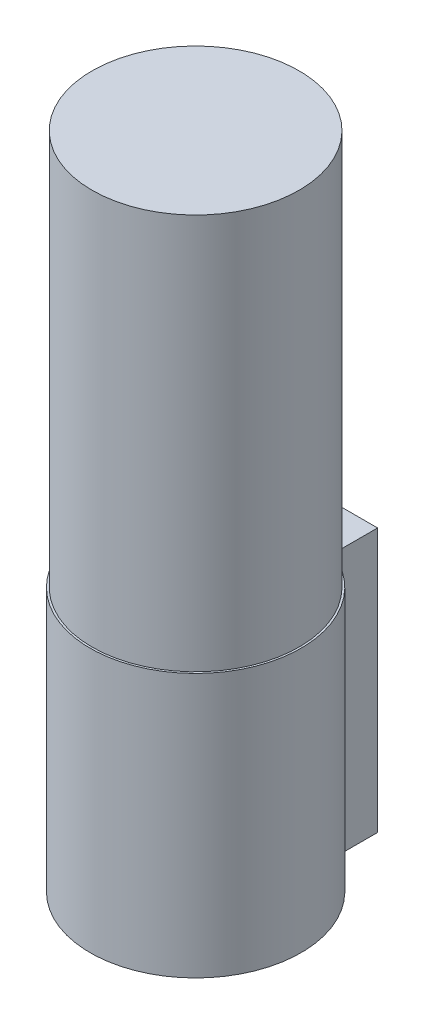
ISO-10303-21;
HEADER;
FILE_DESCRIPTION(('STEP AP214'),'2;1');
FILE_NAME('part.step','',(''),(''),'','','');
FILE_SCHEMA(('AUTOMOTIVE_DESIGN { 1 0 10303 214 1 1 1 1 }'));
ENDSEC;
DATA;
#1=APPLICATION_CONTEXT('core data for automotive mechanical design processes');
#2=APPLICATION_PROTOCOL_DEFINITION('international standard','automotive_design',2000,#1);
#3=PRODUCT_CONTEXT('',#1,'mechanical');
#4=PRODUCT('Part','Part','',(#3));
#5=PRODUCT_RELATED_PRODUCT_CATEGORY('part','',(#4));
#6=PRODUCT_DEFINITION_FORMATION('','',#4);
#7=PRODUCT_DEFINITION_CONTEXT('part definition',#1,'design');
#8=PRODUCT_DEFINITION('design','',#6,#7);
#9=PRODUCT_DEFINITION_SHAPE('','',#8);
#10=(LENGTH_UNIT() NAMED_UNIT(*) SI_UNIT(.MILLI.,.METRE.));
#11=(NAMED_UNIT(*) PLANE_ANGLE_UNIT() SI_UNIT($,.RADIAN.));
#12=(NAMED_UNIT(*) SI_UNIT($,.STERADIAN.) SOLID_ANGLE_UNIT());
#13=UNCERTAINTY_MEASURE_WITH_UNIT(LENGTH_MEASURE(1.E-05),#10,'distance_accuracy_value','');
#14=(GEOMETRIC_REPRESENTATION_CONTEXT(3) GLOBAL_UNCERTAINTY_ASSIGNED_CONTEXT((#13)) GLOBAL_UNIT_ASSIGNED_CONTEXT((#10,
#11,#12)) REPRESENTATION_CONTEXT('',''));
#15=CARTESIAN_POINT('',(0.,0.,0.));
#16=DIRECTION('',(0.,0.,1.));
#17=DIRECTION('',(1.,0.,0.));
#18=AXIS2_PLACEMENT_3D('',#15,#16,#17);
#19=CARTESIAN_POINT('',(0.,10.,0.));
#20=DIRECTION('',(0.,-1.,0.));
#21=DIRECTION('',(0.,0.,-1.));
#22=AXIS2_PLACEMENT_3D('',#19,#20,#21);
#23=CYLINDRICAL_SURFACE('',#22,4.);
#24=CARTESIAN_POINT('',(0.,0.,0.));
#25=DIRECTION('',(0.,1.,0.));
#26=DIRECTION('',(0.,0.,1.));
#27=AXIS2_PLACEMENT_3D('',#24,#25,#26);
#28=CIRCLE('',#27,4.);
#29=CARTESIAN_POINT('',(-1.5,0.,-3.70809924354783));
#30=VERTEX_POINT('',#29);
#31=CARTESIAN_POINT('',(1.5,0.,-3.70809924354783));
#32=VERTEX_POINT('',#31);
#33=EDGE_CURVE('E107',#30,#32,#28,.T.);
#34=ORIENTED_EDGE('',*,*,#33,.T.);
#35=DIRECTION('',(0.,-1.,0.));
#36=VECTOR('',#35,1.);
#37=CARTESIAN_POINT('',(1.5,10.,-3.70809924354783));
#38=LINE('',#37,#36);
#39=CARTESIAN_POINT('',(1.5,10.,-3.70809924354783));
#40=VERTEX_POINT('',#39);
#41=EDGE_CURVE('E45',#40,#32,#38,.T.);
#42=ORIENTED_EDGE('',*,*,#41,.F.);
#43=CARTESIAN_POINT('',(0.,10.,0.));
#44=DIRECTION('',(0.,1.,0.));
#45=DIRECTION('',(0.,0.,1.));
#46=AXIS2_PLACEMENT_3D('',#43,#44,#45);
#47=CIRCLE('',#46,4.);
#48=CARTESIAN_POINT('',(-1.5,10.,-3.70809924354783));
#49=VERTEX_POINT('',#48);
#50=EDGE_CURVE('E83',#49,#40,#47,.T.);
#51=ORIENTED_EDGE('',*,*,#50,.F.);
#52=DIRECTION('',(0.,-1.,0.));
#53=VECTOR('',#52,1.);
#54=CARTESIAN_POINT('',(-1.5,10.,-3.70809924354783));
#55=LINE('',#54,#53);
#56=EDGE_CURVE('E103',#49,#30,#55,.T.);
#57=ORIENTED_EDGE('',*,*,#56,.T.);
#58=EDGE_LOOP('',(#34,#42,#51,#57));
#59=FACE_BOUND('',#58,.T.);
#60=ADVANCED_FACE('F42',(#59),#23,.T.);
#61=CARTESIAN_POINT('',(1.5,10.,0.));
#62=DIRECTION('',(1.,0.,0.));
#63=DIRECTION('',(0.,0.,-1.));
#64=AXIS2_PLACEMENT_3D('',#61,#62,#63);
#65=PLANE('',#64);
#66=DIRECTION('',(0.,0.,1.));
#67=VECTOR('',#66,1.);
#68=CARTESIAN_POINT('',(1.5,0.,0.));
#69=LINE('',#68,#67);
#70=CARTESIAN_POINT('',(1.5,0.,-5.4));
#71=VERTEX_POINT('',#70);
#72=EDGE_CURVE('E93',#71,#32,#69,.T.);
#73=ORIENTED_EDGE('',*,*,#72,.F.);
#74=DIRECTION('',(0.,-1.,0.));
#75=VECTOR('',#74,1.);
#76=CARTESIAN_POINT('',(1.5,10.,-5.4));
#77=LINE('',#76,#75);
#78=CARTESIAN_POINT('',(1.5,10.,-5.4));
#79=VERTEX_POINT('',#78);
#80=EDGE_CURVE('E89',#79,#71,#77,.T.);
#81=ORIENTED_EDGE('',*,*,#80,.F.);
#82=DIRECTION('',(0.,0.,1.));
#83=VECTOR('',#82,1.);
#84=CARTESIAN_POINT('',(1.5,10.,0.));
#85=LINE('',#84,#83);
#86=EDGE_CURVE('E91',#79,#40,#85,.T.);
#87=ORIENTED_EDGE('',*,*,#86,.T.);
#88=ORIENTED_EDGE('',*,*,#41,.T.);
#89=EDGE_LOOP('',(#73,#81,#87,#88));
#90=FACE_BOUND('',#89,.T.);
#91=ADVANCED_FACE('F90',(#90),#65,.T.);
#92=CARTESIAN_POINT('',(0.,10.,-5.4));
#93=DIRECTION('',(0.,0.,-1.));
#94=DIRECTION('',(-1.,0.,0.));
#95=AXIS2_PLACEMENT_3D('',#92,#93,#94);
#96=PLANE('',#95);
#97=DIRECTION('',(1.,0.,0.));
#98=VECTOR('',#97,1.);
#99=CARTESIAN_POINT('',(0.,0.,-5.4));
#100=LINE('',#99,#98);
#101=CARTESIAN_POINT('',(-1.5,0.,-5.4));
#102=VERTEX_POINT('',#101);
#103=EDGE_CURVE('E112',#102,#71,#100,.T.);
#104=ORIENTED_EDGE('',*,*,#103,.F.);
#105=DIRECTION('',(0.,-1.,0.));
#106=VECTOR('',#105,1.);
#107=CARTESIAN_POINT('',(-1.5,10.,-5.4));
#108=LINE('',#107,#106);
#109=CARTESIAN_POINT('',(-1.5,10.,-5.4));
#110=VERTEX_POINT('',#109);
#111=EDGE_CURVE('E75',#110,#102,#108,.T.);
#112=ORIENTED_EDGE('',*,*,#111,.F.);
#113=DIRECTION('',(1.,0.,0.));
#114=VECTOR('',#113,1.);
#115=CARTESIAN_POINT('',(0.,10.,-5.4));
#116=LINE('',#115,#114);
#117=EDGE_CURVE('E99',#110,#79,#116,.T.);
#118=ORIENTED_EDGE('',*,*,#117,.T.);
#119=ORIENTED_EDGE('',*,*,#80,.T.);
#120=EDGE_LOOP('',(#104,#112,#118,#119));
#121=FACE_BOUND('',#120,.T.);
#122=ADVANCED_FACE('F101',(#121),#96,.T.);
#123=CARTESIAN_POINT('',(-1.5,10.,0.));
#124=DIRECTION('',(1.,0.,0.));
#125=DIRECTION('',(0.,0.,-1.));
#126=AXIS2_PLACEMENT_3D('',#123,#124,#125);
#127=PLANE('',#126);
#128=DIRECTION('',(0.,0.,1.));
#129=VECTOR('',#128,1.);
#130=CARTESIAN_POINT('',(-1.5,0.,0.));
#131=LINE('',#130,#129);
#132=EDGE_CURVE('E78',#102,#30,#131,.T.);
#133=ORIENTED_EDGE('',*,*,#132,.T.);
#134=ORIENTED_EDGE('',*,*,#56,.F.);
#135=DIRECTION('',(0.,0.,1.));
#136=VECTOR('',#135,1.);
#137=CARTESIAN_POINT('',(-1.5,10.,0.));
#138=LINE('',#137,#136);
#139=EDGE_CURVE('E59',#110,#49,#138,.T.);
#140=ORIENTED_EDGE('',*,*,#139,.F.);
#141=ORIENTED_EDGE('',*,*,#111,.T.);
#142=EDGE_LOOP('',(#133,#134,#140,#141));
#143=FACE_BOUND('',#142,.T.);
#144=ADVANCED_FACE('F130',(#143),#127,.F.);
#145=CARTESIAN_POINT('',(0.,10.,0.));
#146=DIRECTION('',(0.,1.,0.));
#147=DIRECTION('',(0.,0.,1.));
#148=AXIS2_PLACEMENT_3D('',#145,#146,#147);
#149=PLANE('',#148);
#150=CARTESIAN_POINT('',(0.,10.,0.));
#151=DIRECTION('',(0.,1.,0.));
#152=DIRECTION('',(0.,0.,1.));
#153=AXIS2_PLACEMENT_3D('',#150,#151,#152);
#154=CIRCLE('',#153,3.925);
#155=CARTESIAN_POINT('',(0.,10.,3.925));
#156=VERTEX_POINT('',#155);
#157=EDGE_CURVE('E11',#156,#156,#154,.T.);
#158=ORIENTED_EDGE('',*,*,#157,.F.);
#159=EDGE_LOOP('',(#158));
#160=FACE_BOUND('',#159,.T.);
#161=ORIENTED_EDGE('',*,*,#50,.T.);
#162=ORIENTED_EDGE('',*,*,#86,.F.);
#163=ORIENTED_EDGE('',*,*,#117,.F.);
#164=ORIENTED_EDGE('',*,*,#139,.T.);
#165=EDGE_LOOP('',(#161,#162,#163,#164));
#166=FACE_BOUND('',#165,.T.);
#167=ADVANCED_FACE('F98',(#160,#166),#149,.T.);
#168=CARTESIAN_POINT('',(0.,0.,0.));
#169=DIRECTION('',(0.,1.,0.));
#170=DIRECTION('',(0.,0.,1.));
#171=AXIS2_PLACEMENT_3D('',#168,#169,#170);
#172=PLANE('',#171);
#173=ORIENTED_EDGE('',*,*,#33,.F.);
#174=ORIENTED_EDGE('',*,*,#132,.F.);
#175=ORIENTED_EDGE('',*,*,#103,.T.);
#176=ORIENTED_EDGE('',*,*,#72,.T.);
#177=EDGE_LOOP('',(#173,#174,#175,#176));
#178=FACE_BOUND('',#177,.T.);
#179=ADVANCED_FACE('F119',(#178),#172,.F.);
#180=CARTESIAN_POINT('',(0.,25.,0.));
#181=DIRECTION('',(0.,-1.,0.));
#182=DIRECTION('',(0.,0.,-1.));
#183=AXIS2_PLACEMENT_3D('',#180,#181,#182);
#184=CYLINDRICAL_SURFACE('',#183,3.925);
#185=CARTESIAN_POINT('',(0.,25.,0.));
#186=DIRECTION('',(0.,1.,0.));
#187=DIRECTION('',(0.,0.,1.));
#188=AXIS2_PLACEMENT_3D('',#185,#186,#187);
#189=CIRCLE('',#188,3.925);
#190=CARTESIAN_POINT('',(0.,25.,3.925));
#191=VERTEX_POINT('',#190);
#192=EDGE_CURVE('E110',#191,#191,#189,.T.);
#193=ORIENTED_EDGE('',*,*,#192,.F.);
#194=EDGE_LOOP('',(#193));
#195=FACE_BOUND('',#194,.T.);
#196=ORIENTED_EDGE('',*,*,#157,.T.);
#197=EDGE_LOOP('',(#196));
#198=FACE_BOUND('',#197,.T.);
#199=ADVANCED_FACE('F121',(#195,#198),#184,.T.);
#200=CARTESIAN_POINT('',(0.,25.,0.));
#201=DIRECTION('',(0.,1.,0.));
#202=DIRECTION('',(0.,0.,1.));
#203=AXIS2_PLACEMENT_3D('',#200,#201,#202);
#204=PLANE('',#203);
#205=ORIENTED_EDGE('',*,*,#192,.T.);
#206=EDGE_LOOP('',(#205));
#207=FACE_BOUND('',#206,.T.);
#208=ADVANCED_FACE('F127',(#207),#204,.T.);
#209=CLOSED_SHELL('',(#60,#91,#122,#144,#167,#179,#199,#208));
#210=MANIFOLD_SOLID_BREP('B2',#209);
#211=ADVANCED_BREP_SHAPE_REPRESENTATION('',(#18,#210),#14);
#212=SHAPE_DEFINITION_REPRESENTATION(#9,#211);
ENDSEC;
END-ISO-10303-21;
